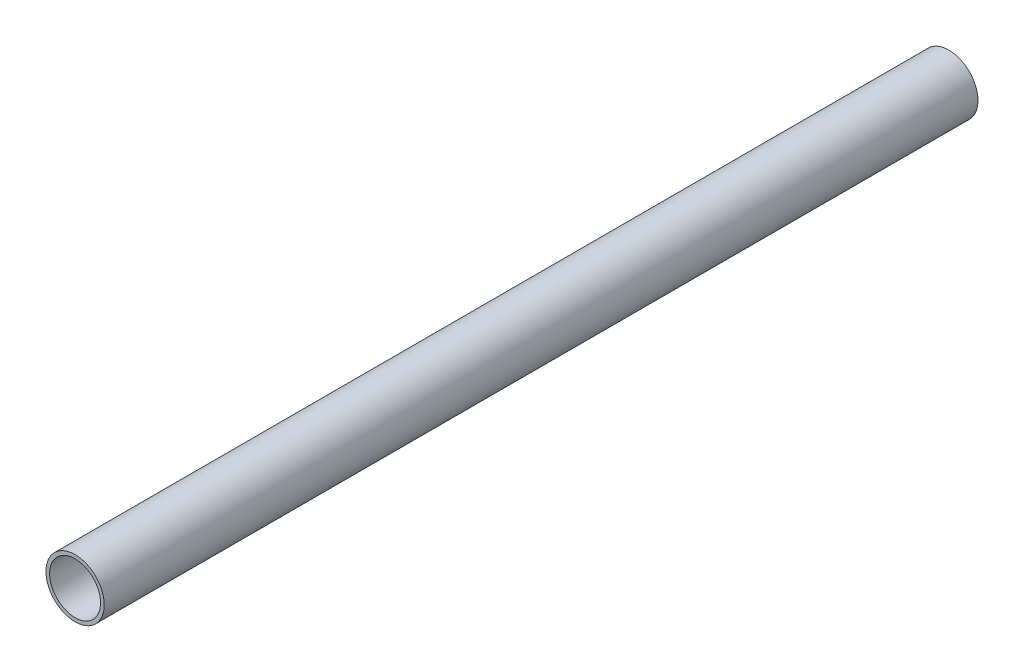
ISO-10303-21;
HEADER;
FILE_DESCRIPTION(('STEP AP214'),'2;1');
FILE_NAME('part.step','',(''),(''),'','','');
FILE_SCHEMA(('AUTOMOTIVE_DESIGN { 1 0 10303 214 1 1 1 1 }'));
ENDSEC;
DATA;
#1=APPLICATION_CONTEXT('core data for automotive mechanical design processes');
#2=APPLICATION_PROTOCOL_DEFINITION('international standard','automotive_design',2000,#1);
#3=PRODUCT_CONTEXT('',#1,'mechanical');
#4=PRODUCT('Part','Part','',(#3));
#5=PRODUCT_RELATED_PRODUCT_CATEGORY('part','',(#4));
#6=PRODUCT_DEFINITION_FORMATION('','',#4);
#7=PRODUCT_DEFINITION_CONTEXT('part definition',#1,'design');
#8=PRODUCT_DEFINITION('design','',#6,#7);
#9=PRODUCT_DEFINITION_SHAPE('','',#8);
#10=(LENGTH_UNIT() NAMED_UNIT(*) SI_UNIT(.MILLI.,.METRE.));
#11=(NAMED_UNIT(*) PLANE_ANGLE_UNIT() SI_UNIT($,.RADIAN.));
#12=(NAMED_UNIT(*) SI_UNIT($,.STERADIAN.) SOLID_ANGLE_UNIT());
#13=UNCERTAINTY_MEASURE_WITH_UNIT(LENGTH_MEASURE(1.E-05),#10,'distance_accuracy_value','');
#14=(GEOMETRIC_REPRESENTATION_CONTEXT(3) GLOBAL_UNCERTAINTY_ASSIGNED_CONTEXT((#13)) GLOBAL_UNIT_ASSIGNED_CONTEXT((#10,
#11,#12)) REPRESENTATION_CONTEXT('',''));
#15=CARTESIAN_POINT('',(0.,0.,0.));
#16=DIRECTION('',(0.,0.,1.));
#17=DIRECTION('',(1.,0.,0.));
#18=AXIS2_PLACEMENT_3D('',#15,#16,#17);
#19=CARTESIAN_POINT('',(0.,0.,240.));
#20=DIRECTION('',(0.,0.,1.));
#21=DIRECTION('',(1.,0.,0.));
#22=AXIS2_PLACEMENT_3D('',#19,#20,#21);
#23=PLANE('',#22);
#24=CARTESIAN_POINT('',(0.,0.,240.));
#25=DIRECTION('',(0.,0.,1.));
#26=DIRECTION('',(1.,0.,0.));
#27=AXIS2_PLACEMENT_3D('',#24,#25,#26);
#28=CIRCLE('',#27,8.);
#29=CARTESIAN_POINT('',(8.,0.,240.));
#30=VERTEX_POINT('',#29);
#31=EDGE_CURVE('E10',#30,#30,#28,.T.);
#32=ORIENTED_EDGE('',*,*,#31,.T.);
#33=EDGE_LOOP('',(#32));
#34=FACE_BOUND('',#33,.T.);
#35=CARTESIAN_POINT('',(0.,0.,240.));
#36=DIRECTION('',(0.,0.,1.));
#37=DIRECTION('',(1.,0.,0.));
#38=AXIS2_PLACEMENT_3D('',#35,#36,#37);
#39=CIRCLE('',#38,7.);
#40=CARTESIAN_POINT('',(7.,0.,240.));
#41=VERTEX_POINT('',#40);
#42=EDGE_CURVE('E47',#41,#41,#39,.T.);
#43=ORIENTED_EDGE('',*,*,#42,.F.);
#44=EDGE_LOOP('',(#43));
#45=FACE_BOUND('',#44,.T.);
#46=ADVANCED_FACE('F36',(#34,#45),#23,.T.);
#47=CARTESIAN_POINT('',(0.,0.,0.));
#48=DIRECTION('',(0.,0.,1.));
#49=DIRECTION('',(1.,0.,0.));
#50=AXIS2_PLACEMENT_3D('',#47,#48,#49);
#51=PLANE('',#50);
#52=CARTESIAN_POINT('',(0.,0.,0.));
#53=DIRECTION('',(0.,0.,1.));
#54=DIRECTION('',(1.,0.,0.));
#55=AXIS2_PLACEMENT_3D('',#52,#53,#54);
#56=CIRCLE('',#55,8.);
#57=CARTESIAN_POINT('',(8.,0.,0.));
#58=VERTEX_POINT('',#57);
#59=EDGE_CURVE('E40',#58,#58,#56,.T.);
#60=ORIENTED_EDGE('',*,*,#59,.F.);
#61=EDGE_LOOP('',(#60));
#62=FACE_BOUND('',#61,.T.);
#63=CARTESIAN_POINT('',(0.,0.,0.));
#64=DIRECTION('',(0.,0.,1.));
#65=DIRECTION('',(1.,0.,0.));
#66=AXIS2_PLACEMENT_3D('',#63,#64,#65);
#67=CIRCLE('',#66,7.);
#68=CARTESIAN_POINT('',(7.,0.,0.));
#69=VERTEX_POINT('',#68);
#70=EDGE_CURVE('E49',#69,#69,#67,.T.);
#71=ORIENTED_EDGE('',*,*,#70,.T.);
#72=EDGE_LOOP('',(#71));
#73=FACE_BOUND('',#72,.T.);
#74=ADVANCED_FACE('F59',(#62,#73),#51,.F.);
#75=CARTESIAN_POINT('',(0.,0.,240.));
#76=DIRECTION('',(0.,0.,-1.));
#77=DIRECTION('',(-1.,0.,0.));
#78=AXIS2_PLACEMENT_3D('',#75,#76,#77);
#79=CYLINDRICAL_SURFACE('',#78,8.);
#80=ORIENTED_EDGE('',*,*,#31,.F.);
#81=EDGE_LOOP('',(#80));
#82=FACE_BOUND('',#81,.T.);
#83=ORIENTED_EDGE('',*,*,#59,.T.);
#84=EDGE_LOOP('',(#83));
#85=FACE_BOUND('',#84,.T.);
#86=ADVANCED_FACE('F38',(#82,#85),#79,.T.);
#87=CARTESIAN_POINT('',(0.,0.,240.));
#88=DIRECTION('',(0.,0.,-1.));
#89=DIRECTION('',(-1.,0.,0.));
#90=AXIS2_PLACEMENT_3D('',#87,#88,#89);
#91=CYLINDRICAL_SURFACE('',#90,7.);
#92=ORIENTED_EDGE('',*,*,#42,.T.);
#93=EDGE_LOOP('',(#92));
#94=FACE_BOUND('',#93,.T.);
#95=ORIENTED_EDGE('',*,*,#70,.F.);
#96=EDGE_LOOP('',(#95));
#97=FACE_BOUND('',#96,.T.);
#98=ADVANCED_FACE('F55',(#94,#97),#91,.F.);
#99=CLOSED_SHELL('',(#46,#74,#86,#98));
#100=MANIFOLD_SOLID_BREP('B2',#99);
#101=ADVANCED_BREP_SHAPE_REPRESENTATION('',(#18,#100),#14);
#102=SHAPE_DEFINITION_REPRESENTATION(#9,#101);
ENDSEC;
END-ISO-10303-21;
